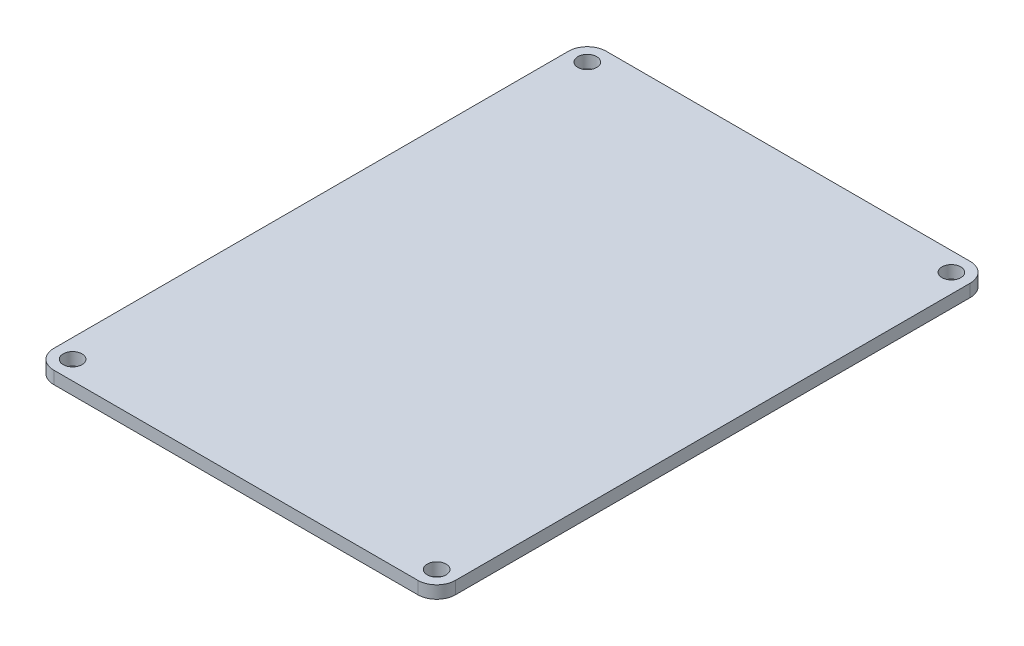
ISO-10303-21;
HEADER;
FILE_DESCRIPTION(('STEP AP214'),'2;1');
FILE_NAME('part.step','',(''),(''),'','','');
FILE_SCHEMA(('AUTOMOTIVE_DESIGN { 1 0 10303 214 1 1 1 1 }'));
ENDSEC;
DATA;
#1=APPLICATION_CONTEXT('core data for automotive mechanical design processes');
#2=APPLICATION_PROTOCOL_DEFINITION('international standard','automotive_design',2000,#1);
#3=PRODUCT_CONTEXT('',#1,'mechanical');
#4=PRODUCT('Part','Part','',(#3));
#5=PRODUCT_RELATED_PRODUCT_CATEGORY('part','',(#4));
#6=PRODUCT_DEFINITION_FORMATION('','',#4);
#7=PRODUCT_DEFINITION_CONTEXT('part definition',#1,'design');
#8=PRODUCT_DEFINITION('design','',#6,#7);
#9=PRODUCT_DEFINITION_SHAPE('','',#8);
#10=(LENGTH_UNIT() NAMED_UNIT(*) SI_UNIT(.MILLI.,.METRE.));
#11=(NAMED_UNIT(*) PLANE_ANGLE_UNIT() SI_UNIT($,.RADIAN.));
#12=(NAMED_UNIT(*) SI_UNIT($,.STERADIAN.) SOLID_ANGLE_UNIT());
#13=UNCERTAINTY_MEASURE_WITH_UNIT(LENGTH_MEASURE(1.E-05),#10,'distance_accuracy_value','');
#14=(GEOMETRIC_REPRESENTATION_CONTEXT(3) GLOBAL_UNCERTAINTY_ASSIGNED_CONTEXT((#13)) GLOBAL_UNIT_ASSIGNED_CONTEXT((#10,
#11,#12)) REPRESENTATION_CONTEXT('',''));
#15=CARTESIAN_POINT('',(0.,0.,0.));
#16=DIRECTION('',(0.,0.,1.));
#17=DIRECTION('',(1.,0.,0.));
#18=AXIS2_PLACEMENT_3D('',#15,#16,#17);
#19=CARTESIAN_POINT('',(32.,1.,44.));
#20=DIRECTION('',(-1.,0.,0.));
#21=DIRECTION('',(0.,0.,1.));
#22=AXIS2_PLACEMENT_3D('',#19,#20,#21);
#23=PLANE('',#22);
#24=DIRECTION('',(0.,0.,-1.));
#25=VECTOR('',#24,1.);
#26=CARTESIAN_POINT('',(32.,-1.,44.));
#27=LINE('',#26,#25);
#28=CARTESIAN_POINT('',(32.,-1.,41.));
#29=VERTEX_POINT('',#28);
#30=CARTESIAN_POINT('',(32.,-1.,-41.));
#31=VERTEX_POINT('',#30);
#32=EDGE_CURVE('E131',#29,#31,#27,.T.);
#33=ORIENTED_EDGE('',*,*,#32,.T.);
#34=DIRECTION('',(0.,-1.,0.));
#35=VECTOR('',#34,1.);
#36=CARTESIAN_POINT('',(32.,1.,-41.));
#37=LINE('',#36,#35);
#38=CARTESIAN_POINT('',(32.,1.,-41.));
#39=VERTEX_POINT('',#38);
#40=EDGE_CURVE('E153',#31,#39,#37,.F.);
#41=ORIENTED_EDGE('',*,*,#40,.T.);
#42=DIRECTION('',(0.,0.,-1.));
#43=VECTOR('',#42,1.);
#44=CARTESIAN_POINT('',(32.,1.,44.));
#45=LINE('',#44,#43);
#46=CARTESIAN_POINT('',(32.,1.,41.));
#47=VERTEX_POINT('',#46);
#48=EDGE_CURVE('E129',#47,#39,#45,.T.);
#49=ORIENTED_EDGE('',*,*,#48,.F.);
#50=DIRECTION('',(0.,-1.,0.));
#51=VECTOR('',#50,1.);
#52=CARTESIAN_POINT('',(32.,1.,41.));
#53=LINE('',#52,#51);
#54=EDGE_CURVE('E150',#47,#29,#53,.T.);
#55=ORIENTED_EDGE('',*,*,#54,.T.);
#56=EDGE_LOOP('',(#33,#41,#49,#55));
#57=FACE_BOUND('',#56,.T.);
#58=ADVANCED_FACE('F34',(#57),#23,.F.);
#59=CARTESIAN_POINT('',(-32.,1.,-44.));
#60=DIRECTION('',(0.,0.,1.));
#61=DIRECTION('',(1.,0.,0.));
#62=AXIS2_PLACEMENT_3D('',#59,#60,#61);
#63=PLANE('',#62);
#64=DIRECTION('',(-1.,0.,0.));
#65=VECTOR('',#64,1.);
#66=CARTESIAN_POINT('',(-32.,-1.,-44.));
#67=LINE('',#66,#65);
#68=CARTESIAN_POINT('',(29.,-1.,-44.));
#69=VERTEX_POINT('',#68);
#70=CARTESIAN_POINT('',(-29.,-1.,-44.));
#71=VERTEX_POINT('',#70);
#72=EDGE_CURVE('E127',#69,#71,#67,.T.);
#73=ORIENTED_EDGE('',*,*,#72,.T.);
#74=DIRECTION('',(0.,-1.,0.));
#75=VECTOR('',#74,1.);
#76=CARTESIAN_POINT('',(-29.,1.,-44.));
#77=LINE('',#76,#75);
#78=CARTESIAN_POINT('',(-29.,1.,-44.));
#79=VERTEX_POINT('',#78);
#80=EDGE_CURVE('E105',#71,#79,#77,.F.);
#81=ORIENTED_EDGE('',*,*,#80,.T.);
#82=DIRECTION('',(-1.,0.,0.));
#83=VECTOR('',#82,1.);
#84=CARTESIAN_POINT('',(-32.,1.,-44.));
#85=LINE('',#84,#83);
#86=CARTESIAN_POINT('',(29.,1.,-44.));
#87=VERTEX_POINT('',#86);
#88=EDGE_CURVE('E167',#87,#79,#85,.T.);
#89=ORIENTED_EDGE('',*,*,#88,.F.);
#90=DIRECTION('',(0.,-1.,0.));
#91=VECTOR('',#90,1.);
#92=CARTESIAN_POINT('',(29.,1.,-44.));
#93=LINE('',#92,#91);
#94=EDGE_CURVE('E110',#87,#69,#93,.T.);
#95=ORIENTED_EDGE('',*,*,#94,.T.);
#96=EDGE_LOOP('',(#73,#81,#89,#95));
#97=FACE_BOUND('',#96,.T.);
#98=ADVANCED_FACE('F172',(#97),#63,.F.);
#99=CARTESIAN_POINT('',(-32.,1.,44.));
#100=DIRECTION('',(1.,0.,0.));
#101=DIRECTION('',(0.,0.,-1.));
#102=AXIS2_PLACEMENT_3D('',#99,#100,#101);
#103=PLANE('',#102);
#104=DIRECTION('',(0.,0.,1.));
#105=VECTOR('',#104,1.);
#106=CARTESIAN_POINT('',(-32.,1.,44.));
#107=LINE('',#106,#105);
#108=CARTESIAN_POINT('',(-32.,1.,-41.));
#109=VERTEX_POINT('',#108);
#110=CARTESIAN_POINT('',(-32.,1.,41.));
#111=VERTEX_POINT('',#110);
#112=EDGE_CURVE('E119',#109,#111,#107,.T.);
#113=ORIENTED_EDGE('',*,*,#112,.F.);
#114=DIRECTION('',(0.,-1.,0.));
#115=VECTOR('',#114,1.);
#116=CARTESIAN_POINT('',(-32.,1.,-41.));
#117=LINE('',#116,#115);
#118=CARTESIAN_POINT('',(-32.,-1.,-41.));
#119=VERTEX_POINT('',#118);
#120=EDGE_CURVE('E104',#109,#119,#117,.T.);
#121=ORIENTED_EDGE('',*,*,#120,.T.);
#122=DIRECTION('',(0.,0.,1.));
#123=VECTOR('',#122,1.);
#124=CARTESIAN_POINT('',(-32.,-1.,44.));
#125=LINE('',#124,#123);
#126=CARTESIAN_POINT('',(-32.,-1.,41.));
#127=VERTEX_POINT('',#126);
#128=EDGE_CURVE('E117',#119,#127,#125,.T.);
#129=ORIENTED_EDGE('',*,*,#128,.T.);
#130=DIRECTION('',(0.,-1.,0.));
#131=VECTOR('',#130,1.);
#132=CARTESIAN_POINT('',(-32.,1.,41.));
#133=LINE('',#132,#131);
#134=EDGE_CURVE('E121',#127,#111,#133,.F.);
#135=ORIENTED_EDGE('',*,*,#134,.T.);
#136=EDGE_LOOP('',(#113,#121,#129,#135));
#137=FACE_BOUND('',#136,.T.);
#138=ADVANCED_FACE('F116',(#137),#103,.F.);
#139=CARTESIAN_POINT('',(-32.,1.,44.));
#140=DIRECTION('',(0.,0.,-1.));
#141=DIRECTION('',(-1.,0.,0.));
#142=AXIS2_PLACEMENT_3D('',#139,#140,#141);
#143=PLANE('',#142);
#144=DIRECTION('',(1.,0.,0.));
#145=VECTOR('',#144,1.);
#146=CARTESIAN_POINT('',(-32.,1.,44.));
#147=LINE('',#146,#145);
#148=CARTESIAN_POINT('',(-29.,1.,44.));
#149=VERTEX_POINT('',#148);
#150=CARTESIAN_POINT('',(29.,1.,44.));
#151=VERTEX_POINT('',#150);
#152=EDGE_CURVE('E135',#149,#151,#147,.T.);
#153=ORIENTED_EDGE('',*,*,#152,.F.);
#154=DIRECTION('',(0.,-1.,0.));
#155=VECTOR('',#154,1.);
#156=CARTESIAN_POINT('',(-29.,1.,44.));
#157=LINE('',#156,#155);
#158=CARTESIAN_POINT('',(-29.,-1.,44.));
#159=VERTEX_POINT('',#158);
#160=EDGE_CURVE('E11',#149,#159,#157,.T.);
#161=ORIENTED_EDGE('',*,*,#160,.T.);
#162=DIRECTION('',(1.,0.,0.));
#163=VECTOR('',#162,1.);
#164=CARTESIAN_POINT('',(-32.,-1.,44.));
#165=LINE('',#164,#163);
#166=CARTESIAN_POINT('',(29.,-1.,44.));
#167=VERTEX_POINT('',#166);
#168=EDGE_CURVE('E126',#159,#167,#165,.T.);
#169=ORIENTED_EDGE('',*,*,#168,.T.);
#170=DIRECTION('',(0.,-1.,0.));
#171=VECTOR('',#170,1.);
#172=CARTESIAN_POINT('',(29.,1.,44.));
#173=LINE('',#172,#171);
#174=EDGE_CURVE('E42',#167,#151,#173,.F.);
#175=ORIENTED_EDGE('',*,*,#174,.T.);
#176=EDGE_LOOP('',(#153,#161,#169,#175));
#177=FACE_BOUND('',#176,.T.);
#178=ADVANCED_FACE('F222',(#177),#143,.F.);
#179=CARTESIAN_POINT('',(0.,1.,0.));
#180=DIRECTION('',(0.,-1.,0.));
#181=DIRECTION('',(0.,0.,-1.));
#182=AXIS2_PLACEMENT_3D('',#179,#180,#181);
#183=PLANE('',#182);
#184=CARTESIAN_POINT('',(-29.,1.,41.));
#185=DIRECTION('',(0.,-1.,0.));
#186=DIRECTION('',(0.,0.,-1.));
#187=AXIS2_PLACEMENT_3D('',#184,#185,#186);
#188=CIRCLE('',#187,1.5);
#189=CARTESIAN_POINT('',(-29.,1.,39.5));
#190=VERTEX_POINT('',#189);
#191=EDGE_CURVE('E195',#190,#190,#188,.F.);
#192=ORIENTED_EDGE('',*,*,#191,.F.);
#193=EDGE_LOOP('',(#192));
#194=FACE_BOUND('',#193,.T.);
#195=CARTESIAN_POINT('',(29.,1.,41.));
#196=DIRECTION('',(0.,-1.,0.));
#197=DIRECTION('',(0.,0.,-1.));
#198=AXIS2_PLACEMENT_3D('',#195,#196,#197);
#199=CIRCLE('',#198,1.5);
#200=CARTESIAN_POINT('',(29.,1.,39.5));
#201=VERTEX_POINT('',#200);
#202=EDGE_CURVE('E189',#201,#201,#199,.T.);
#203=ORIENTED_EDGE('',*,*,#202,.T.);
#204=EDGE_LOOP('',(#203));
#205=FACE_BOUND('',#204,.T.);
#206=CARTESIAN_POINT('',(29.,1.,-41.));
#207=DIRECTION('',(0.,-1.,0.));
#208=DIRECTION('',(0.,0.,-1.));
#209=AXIS2_PLACEMENT_3D('',#206,#207,#208);
#210=CIRCLE('',#209,1.5);
#211=CARTESIAN_POINT('',(29.,1.,-42.5));
#212=VERTEX_POINT('',#211);
#213=EDGE_CURVE('E183',#212,#212,#210,.F.);
#214=ORIENTED_EDGE('',*,*,#213,.F.);
#215=EDGE_LOOP('',(#214));
#216=FACE_BOUND('',#215,.T.);
#217=CARTESIAN_POINT('',(-29.,1.,-41.));
#218=DIRECTION('',(0.,-1.,0.));
#219=DIRECTION('',(0.,0.,-1.));
#220=AXIS2_PLACEMENT_3D('',#217,#218,#219);
#221=CIRCLE('',#220,1.5);
#222=CARTESIAN_POINT('',(-29.,1.,-42.5));
#223=VERTEX_POINT('',#222);
#224=EDGE_CURVE('E173',#223,#223,#221,.T.);
#225=ORIENTED_EDGE('',*,*,#224,.T.);
#226=EDGE_LOOP('',(#225));
#227=FACE_BOUND('',#226,.T.);
#228=ORIENTED_EDGE('',*,*,#88,.T.);
#229=CARTESIAN_POINT('',(-29.,1.,-41.));
#230=DIRECTION('',(0.,-1.,0.));
#231=DIRECTION('',(0.,0.,-1.));
#232=AXIS2_PLACEMENT_3D('',#229,#230,#231);
#233=CIRCLE('',#232,3.);
#234=EDGE_CURVE('E148',#79,#109,#233,.F.);
#235=ORIENTED_EDGE('',*,*,#234,.T.);
#236=ORIENTED_EDGE('',*,*,#112,.T.);
#237=CARTESIAN_POINT('',(-29.,1.,41.));
#238=DIRECTION('',(0.,-1.,0.));
#239=DIRECTION('',(0.,0.,-1.));
#240=AXIS2_PLACEMENT_3D('',#237,#238,#239);
#241=CIRCLE('',#240,3.);
#242=EDGE_CURVE('E55',#111,#149,#241,.F.);
#243=ORIENTED_EDGE('',*,*,#242,.T.);
#244=ORIENTED_EDGE('',*,*,#152,.T.);
#245=CARTESIAN_POINT('',(29.,1.,41.));
#246=DIRECTION('',(0.,-1.,0.));
#247=DIRECTION('',(0.,0.,-1.));
#248=AXIS2_PLACEMENT_3D('',#245,#246,#247);
#249=CIRCLE('',#248,3.);
#250=EDGE_CURVE('E143',#151,#47,#249,.F.);
#251=ORIENTED_EDGE('',*,*,#250,.T.);
#252=ORIENTED_EDGE('',*,*,#48,.T.);
#253=CARTESIAN_POINT('',(29.,1.,-41.));
#254=DIRECTION('',(0.,-1.,0.));
#255=DIRECTION('',(0.,0.,-1.));
#256=AXIS2_PLACEMENT_3D('',#253,#254,#255);
#257=CIRCLE('',#256,3.);
#258=EDGE_CURVE('E146',#39,#87,#257,.F.);
#259=ORIENTED_EDGE('',*,*,#258,.T.);
#260=EDGE_LOOP('',(#228,#235,#236,#243,#244,#251,#252,#259));
#261=FACE_BOUND('',#260,.T.);
#262=ADVANCED_FACE('F164',(#194,#205,#216,#227,#261),#183,.F.);
#263=CARTESIAN_POINT('',(0.,-1.,0.));
#264=DIRECTION('',(0.,-1.,0.));
#265=DIRECTION('',(0.,0.,-1.));
#266=AXIS2_PLACEMENT_3D('',#263,#264,#265);
#267=PLANE('',#266);
#268=CARTESIAN_POINT('',(-29.,-1.,41.));
#269=DIRECTION('',(0.,-1.,0.));
#270=DIRECTION('',(0.,0.,-1.));
#271=AXIS2_PLACEMENT_3D('',#268,#269,#270);
#272=CIRCLE('',#271,1.5);
#273=CARTESIAN_POINT('',(-29.,-1.,39.5));
#274=VERTEX_POINT('',#273);
#275=EDGE_CURVE('E198',#274,#274,#272,.T.);
#276=ORIENTED_EDGE('',*,*,#275,.F.);
#277=EDGE_LOOP('',(#276));
#278=FACE_BOUND('',#277,.T.);
#279=CARTESIAN_POINT('',(29.,-1.,41.));
#280=DIRECTION('',(0.,1.,0.));
#281=DIRECTION('',(0.,0.,-1.));
#282=AXIS2_PLACEMENT_3D('',#279,#280,#281);
#283=CIRCLE('',#282,1.5);
#284=CARTESIAN_POINT('',(29.,-1.,39.5));
#285=VERTEX_POINT('',#284);
#286=EDGE_CURVE('E192',#285,#285,#283,.T.);
#287=ORIENTED_EDGE('',*,*,#286,.T.);
#288=EDGE_LOOP('',(#287));
#289=FACE_BOUND('',#288,.T.);
#290=CARTESIAN_POINT('',(29.,-1.,-41.));
#291=DIRECTION('',(0.,-1.,0.));
#292=DIRECTION('',(0.,0.,1.));
#293=AXIS2_PLACEMENT_3D('',#290,#291,#292);
#294=CIRCLE('',#293,1.5);
#295=CARTESIAN_POINT('',(29.,-1.,-39.5));
#296=VERTEX_POINT('',#295);
#297=EDGE_CURVE('E186',#296,#296,#294,.T.);
#298=ORIENTED_EDGE('',*,*,#297,.F.);
#299=EDGE_LOOP('',(#298));
#300=FACE_BOUND('',#299,.T.);
#301=CARTESIAN_POINT('',(-29.,-1.,-41.));
#302=DIRECTION('',(0.,1.,0.));
#303=DIRECTION('',(0.,0.,1.));
#304=AXIS2_PLACEMENT_3D('',#301,#302,#303);
#305=CIRCLE('',#304,1.5);
#306=CARTESIAN_POINT('',(-29.,-1.,-39.5));
#307=VERTEX_POINT('',#306);
#308=EDGE_CURVE('E175',#307,#307,#305,.T.);
#309=ORIENTED_EDGE('',*,*,#308,.T.);
#310=EDGE_LOOP('',(#309));
#311=FACE_BOUND('',#310,.T.);
#312=ORIENTED_EDGE('',*,*,#128,.F.);
#313=CARTESIAN_POINT('',(-29.,-1.,-41.));
#314=DIRECTION('',(0.,-1.,0.));
#315=DIRECTION('',(0.,0.,-1.));
#316=AXIS2_PLACEMENT_3D('',#313,#314,#315);
#317=CIRCLE('',#316,3.);
#318=EDGE_CURVE('E100',#119,#71,#317,.T.);
#319=ORIENTED_EDGE('',*,*,#318,.T.);
#320=ORIENTED_EDGE('',*,*,#72,.F.);
#321=CARTESIAN_POINT('',(29.,-1.,-41.));
#322=DIRECTION('',(0.,-1.,0.));
#323=DIRECTION('',(0.,0.,-1.));
#324=AXIS2_PLACEMENT_3D('',#321,#322,#323);
#325=CIRCLE('',#324,3.);
#326=EDGE_CURVE('E111',#69,#31,#325,.T.);
#327=ORIENTED_EDGE('',*,*,#326,.T.);
#328=ORIENTED_EDGE('',*,*,#32,.F.);
#329=CARTESIAN_POINT('',(29.,-1.,41.));
#330=DIRECTION('',(0.,-1.,0.));
#331=DIRECTION('',(0.,0.,-1.));
#332=AXIS2_PLACEMENT_3D('',#329,#330,#331);
#333=CIRCLE('',#332,3.);
#334=EDGE_CURVE('E120',#29,#167,#333,.T.);
#335=ORIENTED_EDGE('',*,*,#334,.T.);
#336=ORIENTED_EDGE('',*,*,#168,.F.);
#337=CARTESIAN_POINT('',(-29.,-1.,41.));
#338=DIRECTION('',(0.,-1.,0.));
#339=DIRECTION('',(0.,0.,-1.));
#340=AXIS2_PLACEMENT_3D('',#337,#338,#339);
#341=CIRCLE('',#340,3.);
#342=EDGE_CURVE('E125',#159,#127,#341,.T.);
#343=ORIENTED_EDGE('',*,*,#342,.T.);
#344=EDGE_LOOP('',(#312,#319,#320,#327,#328,#335,#336,#343));
#345=FACE_BOUND('',#344,.T.);
#346=ADVANCED_FACE('F123',(#278,#289,#300,#311,#345),#267,.T.);
#347=CARTESIAN_POINT('',(-29.,1.,-41.));
#348=DIRECTION('',(0.,-1.,0.));
#349=DIRECTION('',(0.,0.,-1.));
#350=AXIS2_PLACEMENT_3D('',#347,#348,#349);
#351=CYLINDRICAL_SURFACE('',#350,3.);
#352=ORIENTED_EDGE('',*,*,#234,.F.);
#353=ORIENTED_EDGE('',*,*,#80,.F.);
#354=ORIENTED_EDGE('',*,*,#318,.F.);
#355=ORIENTED_EDGE('',*,*,#120,.F.);
#356=EDGE_LOOP('',(#352,#353,#354,#355));
#357=FACE_BOUND('',#356,.T.);
#358=ADVANCED_FACE('F103',(#357),#351,.T.);
#359=CARTESIAN_POINT('',(29.,1.,-41.));
#360=DIRECTION('',(0.,-1.,0.));
#361=DIRECTION('',(0.,0.,-1.));
#362=AXIS2_PLACEMENT_3D('',#359,#360,#361);
#363=CYLINDRICAL_SURFACE('',#362,3.);
#364=ORIENTED_EDGE('',*,*,#258,.F.);
#365=ORIENTED_EDGE('',*,*,#40,.F.);
#366=ORIENTED_EDGE('',*,*,#326,.F.);
#367=ORIENTED_EDGE('',*,*,#94,.F.);
#368=EDGE_LOOP('',(#364,#365,#366,#367));
#369=FACE_BOUND('',#368,.T.);
#370=ADVANCED_FACE('F170',(#369),#363,.T.);
#371=CARTESIAN_POINT('',(-29.,1.,41.));
#372=DIRECTION('',(0.,-1.,0.));
#373=DIRECTION('',(0.,0.,-1.));
#374=AXIS2_PLACEMENT_3D('',#371,#372,#373);
#375=CYLINDRICAL_SURFACE('',#374,3.);
#376=ORIENTED_EDGE('',*,*,#242,.F.);
#377=ORIENTED_EDGE('',*,*,#134,.F.);
#378=ORIENTED_EDGE('',*,*,#342,.F.);
#379=ORIENTED_EDGE('',*,*,#160,.F.);
#380=EDGE_LOOP('',(#376,#377,#378,#379));
#381=FACE_BOUND('',#380,.T.);
#382=ADVANCED_FACE('F242',(#381),#375,.T.);
#383=CARTESIAN_POINT('',(29.,1.,41.));
#384=DIRECTION('',(0.,-1.,0.));
#385=DIRECTION('',(0.,0.,-1.));
#386=AXIS2_PLACEMENT_3D('',#383,#384,#385);
#387=CYLINDRICAL_SURFACE('',#386,3.);
#388=ORIENTED_EDGE('',*,*,#250,.F.);
#389=ORIENTED_EDGE('',*,*,#174,.F.);
#390=ORIENTED_EDGE('',*,*,#334,.F.);
#391=ORIENTED_EDGE('',*,*,#54,.F.);
#392=EDGE_LOOP('',(#388,#389,#390,#391));
#393=FACE_BOUND('',#392,.T.);
#394=ADVANCED_FACE('F36',(#393),#387,.T.);
#395=CARTESIAN_POINT('',(-29.,-1.,-41.));
#396=DIRECTION('',(0.,1.,0.));
#397=DIRECTION('',(0.,0.,1.));
#398=AXIS2_PLACEMENT_3D('',#395,#396,#397);
#399=CYLINDRICAL_SURFACE('',#398,1.5);
#400=ORIENTED_EDGE('',*,*,#308,.F.);
#401=EDGE_LOOP('',(#400));
#402=FACE_BOUND('',#401,.T.);
#403=ORIENTED_EDGE('',*,*,#224,.F.);
#404=EDGE_LOOP('',(#403));
#405=FACE_BOUND('',#404,.T.);
#406=ADVANCED_FACE('F214',(#402,#405),#399,.F.);
#407=CARTESIAN_POINT('',(29.,-1.,-41.));
#408=DIRECTION('',(0.,1.,0.));
#409=DIRECTION('',(0.,0.,1.));
#410=AXIS2_PLACEMENT_3D('',#407,#408,#409);
#411=CYLINDRICAL_SURFACE('',#410,1.5);
#412=ORIENTED_EDGE('',*,*,#297,.T.);
#413=EDGE_LOOP('',(#412));
#414=FACE_BOUND('',#413,.T.);
#415=ORIENTED_EDGE('',*,*,#213,.T.);
#416=EDGE_LOOP('',(#415));
#417=FACE_BOUND('',#416,.T.);
#418=ADVANCED_FACE('F217',(#414,#417),#411,.F.);
#419=CARTESIAN_POINT('',(29.,-1.,41.));
#420=DIRECTION('',(0.,1.,0.));
#421=DIRECTION('',(0.,0.,1.));
#422=AXIS2_PLACEMENT_3D('',#419,#420,#421);
#423=CYLINDRICAL_SURFACE('',#422,1.5);
#424=ORIENTED_EDGE('',*,*,#286,.F.);
#425=EDGE_LOOP('',(#424));
#426=FACE_BOUND('',#425,.T.);
#427=ORIENTED_EDGE('',*,*,#202,.F.);
#428=EDGE_LOOP('',(#427));
#429=FACE_BOUND('',#428,.T.);
#430=ADVANCED_FACE('F262',(#426,#429),#423,.F.);
#431=CARTESIAN_POINT('',(-29.,-1.,41.));
#432=DIRECTION('',(0.,1.,0.));
#433=DIRECTION('',(0.,0.,1.));
#434=AXIS2_PLACEMENT_3D('',#431,#432,#433);
#435=CYLINDRICAL_SURFACE('',#434,1.5);
#436=ORIENTED_EDGE('',*,*,#275,.T.);
#437=EDGE_LOOP('',(#436));
#438=FACE_BOUND('',#437,.T.);
#439=ORIENTED_EDGE('',*,*,#191,.T.);
#440=EDGE_LOOP('',(#439));
#441=FACE_BOUND('',#440,.T.);
#442=ADVANCED_FACE('F202',(#438,#441),#435,.F.);
#443=CLOSED_SHELL('',(#58,#98,#138,#178,#262,#346,#358,#370,#382,#394,#406,#418,#430,#442));
#444=MANIFOLD_SOLID_BREP('B2',#443);
#445=ADVANCED_BREP_SHAPE_REPRESENTATION('',(#18,#444),#14);
#446=SHAPE_DEFINITION_REPRESENTATION(#9,#445);
ENDSEC;
END-ISO-10303-21;
